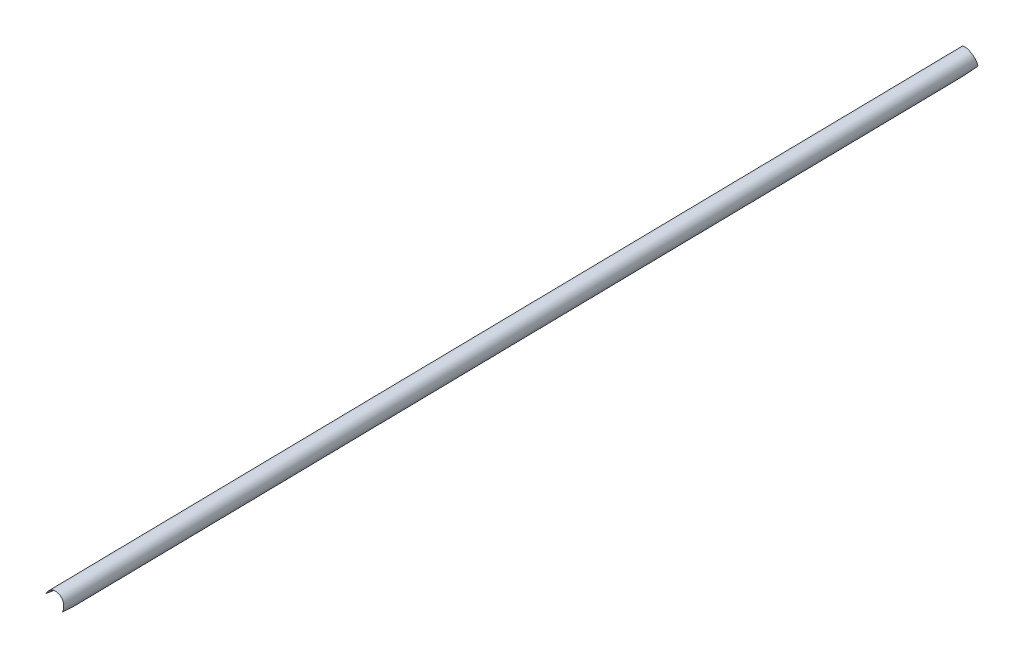
ISO-10303-21;
HEADER;
FILE_DESCRIPTION(('STEP AP214'),'2;1');
FILE_NAME('part.step','',(''),(''),'','','');
FILE_SCHEMA(('AUTOMOTIVE_DESIGN { 1 0 10303 214 1 1 1 1 }'));
ENDSEC;
DATA;
#1=APPLICATION_CONTEXT('core data for automotive mechanical design processes');
#2=APPLICATION_PROTOCOL_DEFINITION('international standard','automotive_design',2000,#1);
#3=PRODUCT_CONTEXT('',#1,'mechanical');
#4=PRODUCT('Part','Part','',(#3));
#5=PRODUCT_RELATED_PRODUCT_CATEGORY('part','',(#4));
#6=PRODUCT_DEFINITION_FORMATION('','',#4);
#7=PRODUCT_DEFINITION_CONTEXT('part definition',#1,'design');
#8=PRODUCT_DEFINITION('design','',#6,#7);
#9=PRODUCT_DEFINITION_SHAPE('','',#8);
#10=(LENGTH_UNIT() NAMED_UNIT(*) SI_UNIT(.MILLI.,.METRE.));
#11=(NAMED_UNIT(*) PLANE_ANGLE_UNIT() SI_UNIT($,.RADIAN.));
#12=(NAMED_UNIT(*) SI_UNIT($,.STERADIAN.) SOLID_ANGLE_UNIT());
#13=UNCERTAINTY_MEASURE_WITH_UNIT(LENGTH_MEASURE(1.E-05),#10,'distance_accuracy_value','');
#14=(GEOMETRIC_REPRESENTATION_CONTEXT(3) GLOBAL_UNCERTAINTY_ASSIGNED_CONTEXT((#13)) GLOBAL_UNIT_ASSIGNED_CONTEXT((#10,
#11,#12)) REPRESENTATION_CONTEXT('',''));
#15=CARTESIAN_POINT('',(0.,0.,0.));
#16=DIRECTION('',(0.,0.,1.));
#17=DIRECTION('',(1.,0.,0.));
#18=AXIS2_PLACEMENT_3D('',#15,#16,#17);
#19=CARTESIAN_POINT('',(324.999999999993,320.000000000003,-1580.));
#20=DIRECTION('',(-0.0876619818920163,-0.10519437827044,0.99058039537993));
#21=DIRECTION('',(0.,-0.994408591727349,-0.10560091239583));
#22=AXIS2_PLACEMENT_3D('',#19,#20,#21);
#23=CYLINDRICAL_SURFACE('',#22,11.3);
#24=CARTESIAN_POINT('',(228.906346641355,193.450798883095,-495.335007357299));
#25=CARTESIAN_POINT('',(229.084722743735,193.419449109905,-495.039847908933));
#26=CARTESIAN_POINT('',(229.253623092946,193.392941622863,-494.738442760999));
#27=CARTESIAN_POINT('',(229.576166320163,193.347594604839,-494.126951019015));
#28=CARTESIAN_POINT('',(229.729801067032,193.32875914394,-493.816859909961));
#29=CARTESIAN_POINT('',(230.024651309465,193.297354565438,-493.189903600017));
#30=CARTESIAN_POINT('',(230.165845067822,193.28479624332,-492.873027699643));
#31=CARTESIAN_POINT('',(230.437539311314,193.264977200147,-492.234553042767));
#32=CARTESIAN_POINT('',(230.568038599133,193.257717071541,-491.912953762192));
#33=CARTESIAN_POINT('',(230.820667381965,193.247712385438,-491.264065766833));
#34=CARTESIAN_POINT('',(230.942738101031,193.244996962547,-490.936753833744));
#35=CARTESIAN_POINT('',(231.178812347464,193.243590884282,-490.279224589377));
#36=CARTESIAN_POINT('',(231.2928155737,193.244900379064,-489.949007170163));
#37=CARTESIAN_POINT('',(231.513601759024,193.251092771302,-489.28660662457));
#38=CARTESIAN_POINT('',(231.620392422021,193.25597178796,-488.95442602131));
#39=CARTESIAN_POINT('',(231.827666710202,193.268953270525,-488.288163302831));
#40=CARTESIAN_POINT('',(231.928150134984,193.277055838797,-487.95408112756));
#41=CARTESIAN_POINT('',(232.228901864607,193.306530946405,-486.92286266796));
#42=CARTESIAN_POINT('',(232.41979352706,193.332786366844,-486.223119294367));
#43=CARTESIAN_POINT('',(232.781604853685,193.396249415354,-484.818961513991));
#44=CARTESIAN_POINT('',(232.952521976425,193.433458434976,-484.114546524845));
#45=CARTESIAN_POINT('',(233.277626543175,193.517838489495,-482.701881545574));
#46=CARTESIAN_POINT('',(233.431800457518,193.565017491468,-481.993628932459));
#47=CARTESIAN_POINT('',(233.725637259058,193.668776939329,-480.574860609513));
#48=CARTESIAN_POINT('',(233.865300847423,193.7253569306,-479.864345010746));
#49=CARTESIAN_POINT('',(234.131561727352,193.847601536044,-478.444057155071));
#50=CARTESIAN_POINT('',(234.258199866144,193.913236138749,-477.734289941639));
#51=CARTESIAN_POINT('',(234.50043965915,194.054010962758,-476.313804791448));
#52=CARTESIAN_POINT('',(234.616041075879,194.129151388526,-475.603086834565));
#53=CARTESIAN_POINT('',(234.837446286698,194.289637946118,-474.181617065538));
#54=CARTESIAN_POINT('',(234.943254556644,194.374979374404,-473.470865418889));
#55=CARTESIAN_POINT('',(235.146286756352,194.557210883326,-472.049638085316));
#56=CARTESIAN_POINT('',(235.243511012088,194.654100525097,-471.339162388935));
#57=CARTESIAN_POINT('',(235.418196715561,194.84798279673,-470.012454615724));
#58=CARTESIAN_POINT('',(235.496576808614,194.943291134696,-469.396098258282));
#59=CARTESIAN_POINT('',(235.648406357622,195.146497440309,-468.164772123489));
#60=CARTESIAN_POINT('',(235.721855265329,195.254396804181,-467.549802507635));
#61=CARTESIAN_POINT('',(235.864560562893,195.486122145514,-466.322140017813));
#62=CARTESIAN_POINT('',(235.933815741641,195.60995269179,-465.709447849044));
#63=CARTESIAN_POINT('',(236.035060470202,195.811557500717,-464.793658677394));
#64=CARTESIAN_POINT('',(236.068366740904,195.881396679684,-464.48895891525));
#65=CARTESIAN_POINT('',(236.134179843666,196.027317308605,-463.88097627572));
#66=CARTESIAN_POINT('',(236.166686706776,196.103398515607,-463.577693343673));
#67=CARTESIAN_POINT('',(236.236922701811,196.277747516162,-462.916923346777));
#68=CARTESIAN_POINT('',(236.274502640094,196.37751351725,-462.559811958254));
#69=CARTESIAN_POINT('',(236.348652293011,196.589950465177,-461.849368476551));
#70=CARTESIAN_POINT('',(236.385222183117,196.702619152773,-461.496035733545));
#71=CARTESIAN_POINT('',(236.45722802378,196.944283796766,-460.794770637445));
#72=CARTESIAN_POINT('',(236.492663825799,197.073281881052,-460.446838994815));
#73=CARTESIAN_POINT('',(236.561929750981,197.352055284574,-459.759218405918));
#74=CARTESIAN_POINT('',(236.595760515704,197.501822206645,-459.419526193214));
#75=CARTESIAN_POINT('',(236.649399821404,197.771316626385,-458.868371400781));
#76=CARTESIAN_POINT('',(236.670003058247,197.88345416383,-458.65328656504));
#77=CARTESIAN_POINT('',(236.709426960596,198.120868295843,-458.230244866014));
#78=CARTESIAN_POINT('',(236.728247573081,198.246145280979,-458.022288214856));
#79=CARTESIAN_POINT('',(236.763160524445,198.51124680967,-457.616322318315));
#80=CARTESIAN_POINT('',(236.779259834492,198.651032654479,-457.418288599001));
#81=CARTESIAN_POINT('',(236.807501886327,198.946814139092,-457.034387822026));
#82=CARTESIAN_POINT('',(236.819645858122,199.102804719709,-456.848516996418));
#83=CARTESIAN_POINT('',(236.836567794861,199.401235519372,-456.524827534103));
#84=CARTESIAN_POINT('',(236.842291355073,199.540866571628,-456.384470008079));
#85=CARTESIAN_POINT('',(236.848912008884,199.830983078117,-456.115355742765));
#86=CARTESIAN_POINT('',(236.849810199826,199.981466056609,-455.986596372472));
#87=CARTESIAN_POINT('',(236.84567143579,200.29236713364,-455.741850295963));
#88=CARTESIAN_POINT('',(236.840635690009,200.452783201737,-455.625860992774));
#89=CARTESIAN_POINT('',(236.823584155192,200.782122008638,-455.407232831261));
#90=CARTESIAN_POINT('',(236.811568016766,200.95104517286,-455.304594641515));
#91=CARTESIAN_POINT('',(236.779725744476,201.294989674343,-455.112975041747));
#92=CARTESIAN_POINT('',(236.759926049959,201.469988557728,-455.02394880164));
#93=CARTESIAN_POINT('',(236.711854184271,201.824710603628,-454.858548310711));
#94=CARTESIAN_POINT('',(236.683581961612,202.004433794848,-454.782174136781));
#95=CARTESIAN_POINT('',(236.61806458397,202.367069597396,-454.640976363745));
#96=CARTESIAN_POINT('',(236.580805389124,202.549986779628,-454.576171116556));
#97=CARTESIAN_POINT('',(236.497071019076,202.917135641824,-454.457043788662));
#98=CARTESIAN_POINT('',(236.450593611755,203.101367629722,-454.40272425329));
#99=CARTESIAN_POINT('',(236.326984143946,203.54645531018,-454.28260660446));
#100=CARTESIAN_POINT('',(236.245146542821,203.807269623702,-454.221448843698));
#101=CARTESIAN_POINT('',(236.062726728038,204.325444980738,-454.11425303536));
#102=CARTESIAN_POINT('',(235.962137928993,204.582804776887,-454.068220315412));
#103=CARTESIAN_POINT('',(235.742446451051,205.091667303815,-453.988328169526));
#104=CARTESIAN_POINT('',(235.623328875651,205.343165133053,-453.95447861164));
#105=CARTESIAN_POINT('',(235.367145928939,205.837961882194,-453.896592110663));
#106=CARTESIAN_POINT('',(235.230082218472,206.081261558188,-453.872554260383));
#107=CARTESIAN_POINT('',(234.936138029315,206.561989779518,-453.831996434652));
#108=CARTESIAN_POINT('',(234.778959182767,206.799247179034,-453.815611812274));
#109=CARTESIAN_POINT('',(234.447462936964,207.261844284722,-453.78934629819));
#110=CARTESIAN_POINT('',(234.273145316162,207.487183836779,-453.779465490569));
#111=CARTESIAN_POINT('',(233.908314454204,207.924428184603,-453.764922947872));
#112=CARTESIAN_POINT('',(233.717805299289,208.136336346609,-453.760259900178));
#113=CARTESIAN_POINT('',(233.321555308751,208.545457150593,-453.755136178475));
#114=CARTESIAN_POINT('',(233.11581387221,208.74266921219,-453.754675670346));
#115=CARTESIAN_POINT('',(232.667547907075,209.141330783778,-453.757296200155));
#116=CARTESIAN_POINT('',(232.423438584114,209.340999952622,-453.760759134578));
#117=CARTESIAN_POINT('',(231.919543244711,209.719393881331,-453.771041918049));
#118=CARTESIAN_POINT('',(231.65975614504,209.898117191462,-453.777861999288));
#119=CARTESIAN_POINT('',(231.126198221788,210.233355499364,-453.794275931706));
#120=CARTESIAN_POINT('',(230.852423212811,210.38986379651,-453.803870617139));
#121=CARTESIAN_POINT('',(230.292855768241,210.679472454453,-453.825444250645));
#122=CARTESIAN_POINT('',(230.007063487597,210.81257311695,-453.837423167984));
#123=CARTESIAN_POINT('',(229.423235876984,211.055343023285,-453.863658597851));
#124=CARTESIAN_POINT('',(229.125123950852,211.164826318805,-453.877931743152));
#125=CARTESIAN_POINT('',(228.520845613355,211.358297399202,-453.908659706934));
#126=CARTESIAN_POINT('',(228.214679116668,211.442284913884,-453.925114548534));
#127=CARTESIAN_POINT('',(227.596547427249,211.584184777348,-453.96035993362));
#128=CARTESIAN_POINT('',(227.284583196523,211.642101412491,-453.979150092505));
#129=CARTESIAN_POINT('',(226.657065544924,211.731522387414,-454.019427116227));
#130=CARTESIAN_POINT('',(226.341512136798,211.763026820972,-454.04091397149));
#131=CARTESIAN_POINT('',(225.709250576285,211.799471781888,-454.087163488993));
#132=CARTESIAN_POINT('',(225.392542978326,211.804423717397,-454.111924739719));
#133=CARTESIAN_POINT('',(224.760165994286,211.787867294798,-454.165591751936));
#134=CARTESIAN_POINT('',(224.444496622735,211.76635856792,-454.194497571183));
#135=CARTESIAN_POINT('',(223.816250704612,211.697144331621,-454.257682583141));
#136=CARTESIAN_POINT('',(223.503677656032,211.649412019693,-454.291967247786));
#137=CARTESIAN_POINT('',(222.884401080991,211.528283710804,-454.367512405962));
#138=CARTESIAN_POINT('',(222.57769737625,211.454888494654,-454.408772687234));
#139=CARTESIAN_POINT('',(221.973552589742,211.283526589802,-454.500304511905));
#140=CARTESIAN_POINT('',(221.676087709229,211.185630165252,-454.550550171529));
#141=CARTESIAN_POINT('',(221.092155474227,210.96636968699,-454.662965473626));
#142=CARTESIAN_POINT('',(220.805690213979,210.845001190675,-454.725137373384));
#143=CARTESIAN_POINT('',(220.247419334293,210.58090601133,-454.864873542486));
#144=CARTESIAN_POINT('',(219.975584198492,210.438224706673,-454.942405220157));
#145=CARTESIAN_POINT('',(219.44946385422,210.134036520854,-455.11736855306));
#146=CARTESIAN_POINT('',(219.195167214736,209.972542089641,-455.214787079544));
#147=CARTESIAN_POINT('',(218.794261846491,209.694601325627,-455.395577573599));
#148=CARTESIAN_POINT('',(218.641388957452,209.582436149759,-455.471721574933));
#149=CARTESIAN_POINT('',(218.345740258341,209.35345218358,-455.635666421718));
#150=CARTESIAN_POINT('',(218.202961111313,209.236634951377,-455.723463386856));
#151=CARTESIAN_POINT('',(217.928871529964,209.00035150112,-455.911577599975));
#152=CARTESIAN_POINT('',(217.797538046007,208.880891244328,-456.011868648094));
#153=CARTESIAN_POINT('',(217.54696649929,208.641112066716,-456.22569982633));
#154=CARTESIAN_POINT('',(217.427728398181,208.520793148618,-456.339239914439));
#155=CARTESIAN_POINT('',(217.201627274746,208.281020551442,-456.57989400785));
#156=CARTESIAN_POINT('',(217.094803999235,208.161570740169,-456.707049234854));
#157=CARTESIAN_POINT('',(216.894116159748,207.925858011345,-456.973892675194));
#158=CARTESIAN_POINT('',(216.800251457928,207.809595059905,-457.11358075519));
#159=CARTESIAN_POINT('',(216.625015253408,207.581676358599,-457.404298884527));
#160=CARTESIAN_POINT('',(216.543654202896,207.470024519698,-457.55533826743));
#161=CARTESIAN_POINT('',(216.392643290475,207.252358741357,-457.867059100495));
#162=CARTESIAN_POINT('',(216.32299783672,207.146346934269,-458.027744149254));
#163=CARTESIAN_POINT('',(216.160505691025,206.886373233337,-458.443487390125));
#164=CARTESIAN_POINT('',(216.074667058124,206.736447759892,-458.703813563675));
#165=CARTESIAN_POINT('',(215.923117723211,206.450470461129,-459.237587950817));
#166=CARTESIAN_POINT('',(215.857421355989,206.314428562156,-459.51104535026));
#167=CARTESIAN_POINT('',(215.741814079727,206.054115755362,-460.068252653972));
#168=CARTESIAN_POINT('',(215.691977358447,205.929902019364,-460.352044204916));
#169=CARTESIAN_POINT('',(215.626874816888,205.751564087348,-460.782342171288));
#170=CARTESIAN_POINT('',(215.606784669547,205.693455443719,-460.926524621738));
#171=CARTESIAN_POINT('',(215.569480730707,205.579651740959,-461.21620905421));
#172=CARTESIAN_POINT('',(215.552266907186,205.523956654966,-461.361711021524));
#173=CARTESIAN_POINT('',(215.505843705228,205.364846783189,-461.787313785757));
#174=CARTESIAN_POINT('',(215.480051789101,205.264346533512,-462.068879132873));
#175=CARTESIAN_POINT('',(215.436152887707,205.06996875526,-462.634900249183));
#176=CARTESIAN_POINT('',(215.418047343789,204.97609247156,-462.919356550256));
#177=CARTESIAN_POINT('',(215.388234534667,204.793754196807,-463.490518625651));
#178=CARTESIAN_POINT('',(215.376531324007,204.705295668185,-463.77722570908));
#179=CARTESIAN_POINT('',(215.358575270939,204.532897246613,-464.352172358848));
#180=CARTESIAN_POINT('',(215.352322796398,204.448957659001,-464.640412027299));
#181=CARTESIAN_POINT('',(215.340570244135,204.202287963403,-465.508234489082));
#182=CARTESIAN_POINT('',(215.342140755068,204.045149564713,-466.089503544346));
#183=CARTESIAN_POINT('',(215.360054986473,203.741048124285,-467.254175548324));
#184=CARTESIAN_POINT('',(215.376393589896,203.594081577054,-467.837577688209));
#185=CARTESIAN_POINT('',(215.421592247368,203.306480622755,-469.007864450682));
#186=CARTESIAN_POINT('',(215.450501019381,203.165873226553,-469.594753769894));
#187=CARTESIAN_POINT('',(215.519419313844,202.889275053593,-470.769002878985));
#188=CARTESIAN_POINT('',(215.559429709063,202.753284640748,-471.356362702231));
#189=CARTESIAN_POINT('',(215.649667944616,202.484439474702,-472.530070357294));
#190=CARTESIAN_POINT('',(215.699880251525,202.351580293075,-473.116418376957));
#191=CARTESIAN_POINT('',(215.810156934894,202.087502337687,-474.28853815738));
#192=CARTESIAN_POINT('',(215.870221042944,201.95628351934,-474.874309933403));
#193=CARTESIAN_POINT('',(215.996444392043,201.70184813012,-476.01188685851));
#194=CARTESIAN_POINT('',(216.062068594454,201.57859774612,-476.563743880726));
#195=CARTESIAN_POINT('',(216.20213192972,201.331929031285,-477.666306024639));
#196=CARTESIAN_POINT('',(216.276571118202,201.208510699396,-478.217011139043));
#197=CARTESIAN_POINT('',(216.43461126643,200.960809262154,-479.31722972636));
#198=CARTESIAN_POINT('',(216.518217124561,200.836525728009,-479.866742400558));
#199=CARTESIAN_POINT('',(216.695046338937,200.586575813579,-480.963902994573));
#200=CARTESIAN_POINT('',(216.788269628716,200.460909442856,-481.51155092725));
#201=CARTESIAN_POINT('',(216.98471847529,200.208017806577,-482.602838600997));
#202=CARTESIAN_POINT('',(217.087911904794,200.080798630881,-483.146485517312));
#203=CARTESIAN_POINT('',(217.305465179436,199.823838183406,-484.230939466429));
#204=CARTESIAN_POINT('',(217.419824805803,199.694096961079,-484.771746554651));
#205=CARTESIAN_POINT('',(217.660884710811,199.431513953388,-485.849595695003));
#206=CARTESIAN_POINT('',(217.787579544923,199.298673555451,-486.386639297066));
#207=CARTESIAN_POINT('',(218.054968459116,199.029121338322,-487.45623013825));
#208=CARTESIAN_POINT('',(218.195661495162,198.892409808396,-487.988777709492));
#209=CARTESIAN_POINT('',(218.493648262209,198.613858751595,-489.049520926403));
#210=CARTESIAN_POINT('',(218.650985582042,198.472006433243,-489.577701034124));
#211=CARTESIAN_POINT('',(218.985046052283,198.182353814681,-490.626549655019));
#212=CARTESIAN_POINT('',(219.161775701882,198.034551530957,-491.147215583314));
#213=CARTESIAN_POINT('',(219.444841769921,197.80717882364,-491.920531692447));
#214=CARTESIAN_POINT('',(219.542290613915,197.730369555458,-492.177256550306));
#215=CARTESIAN_POINT('',(219.743907178527,197.574654702993,-492.687402869537));
#216=CARTESIAN_POINT('',(219.848074420308,197.495749268345,-492.940824564791));
#217=CARTESIAN_POINT('',(220.063976367618,197.335603665136,-493.443493113035));
#218=CARTESIAN_POINT('',(220.175706463031,197.254364935973,-493.692742395865));
#219=CARTESIAN_POINT('',(220.407924141613,197.089174832986,-494.186188530378));
#220=CARTESIAN_POINT('',(220.528410446188,197.0052238562,-494.430386113056));
#221=CARTESIAN_POINT('',(220.780522960273,196.833564511718,-494.914111332393));
#222=CARTESIAN_POINT('',(220.912223275508,196.745833403706,-495.153592560447));
#223=CARTESIAN_POINT('',(221.18801108674,196.566621221534,-495.624117918182));
#224=CARTESIAN_POINT('',(221.332104730933,196.475138298049,-495.855157778269));
#225=CARTESIAN_POINT('',(221.634366025902,196.288333560091,-496.304395867813));
#226=CARTESIAN_POINT('',(221.7924573422,196.193033951979,-496.522654125173));
#227=CARTESIAN_POINT('',(222.126406780729,195.997583726374,-496.94261602));
#228=CARTESIAN_POINT('',(222.302241251363,195.897439656925,-497.144341062447));
#229=CARTESIAN_POINT('',(222.631960054622,195.715802204155,-497.479126461745));
#230=CARTESIAN_POINT('',(222.7813265035,195.635440315239,-497.617197487053));
#231=CARTESIAN_POINT('',(223.094949052165,195.471383782249,-497.873834029889));
#232=CARTESIAN_POINT('',(223.259221237838,195.387685593658,-497.992378076637));
#233=CARTESIAN_POINT('',(223.605988958748,195.216498057468,-498.203358462488));
#234=CARTESIAN_POINT('',(223.788699413988,195.12897291213,-498.295423198143));
#235=CARTESIAN_POINT('',(224.168745700422,194.953401437344,-498.44040327619));
#236=CARTESIAN_POINT('',(224.36603163524,194.865357756203,-498.493445939393));
#237=CARTESIAN_POINT('',(224.718913199978,194.714027456113,-498.544091614214));
#238=CARTESIAN_POINT('',(224.87269705381,194.650021883768,-498.552190177143));
#239=CARTESIAN_POINT('',(225.180660896105,194.525829921697,-498.539747343144));
#240=CARTESIAN_POINT('',(225.334840825478,194.4656429932,-498.519209995884));
#241=CARTESIAN_POINT('',(225.638490434946,194.350922778788,-498.451332569697));
#242=CARTESIAN_POINT('',(225.787976286129,194.296368142748,-498.404098459675));
#243=CARTESIAN_POINT('',(226.079901703072,194.193309277863,-498.286880823334));
#244=CARTESIAN_POINT('',(226.222334592682,194.144810717886,-498.216876200048));
#245=CARTESIAN_POINT('',(226.585306574446,194.025314334604,-498.009144030848));
#246=CARTESIAN_POINT('',(226.798855789709,193.959263450018,-497.856468669636));
#247=CARTESIAN_POINT('',(227.203756278744,193.84067039438,-497.519675163652));
#248=CARTESIAN_POINT('',(227.39503453697,193.788172006601,-497.335458229933));
#249=CARTESIAN_POINT('',(227.703514347913,193.708208134845,-497.005109457079));
#250=CARTESIAN_POINT('',(227.825697487547,193.677961836172,-496.864178517993));
#251=CARTESIAN_POINT('',(228.061751772613,193.621983870084,-496.574618048219));
#252=CARTESIAN_POINT('',(228.175620169086,193.596253691844,-496.425985998962));
#253=CARTESIAN_POINT('',(228.395986290244,193.548666106985,-496.122906753843));
#254=CARTESIAN_POINT('',(228.502487290937,193.526806972224,-495.968462190378));
#255=CARTESIAN_POINT('',(228.709045719155,193.486418866875,-495.654965735628));
#256=CARTESIAN_POINT('',(228.809104242114,193.467889329181,-495.495914634309));
#257=CARTESIAN_POINT('',(228.906346641355,193.450798883095,-495.335007357299));
#258=B_SPLINE_CURVE_WITH_KNOTS('',3,(#24,#25,#26,#27,#28,#29,#30,#31,#32,#33,#34,#35,#36,#37,
#38,#39,#40,#41,#42,#43,#44,#45,#46,#47,#48,#49,#50,#51,#52,#53,#54,#55,#56,#57,#58,#59,#60,#61,
#62,#63,#64,#65,#66,#67,#68,#69,#70,#71,#72,#73,#74,#75,#76,#77,#78,#79,#80,#81,#82,#83,#84,#85,
#86,#87,#88,#89,#90,#91,#92,#93,#94,#95,#96,#97,#98,#99,#100,#101,#102,#103,#104,#105,#106,#107,
#108,#109,#110,#111,#112,#113,#114,#115,#116,#117,#118,#119,#120,#121,#122,#123,#124,#125,#126,
#127,#128,#129,#130,#131,#132,#133,#134,#135,#136,#137,#138,#139,#140,#141,#142,#143,#144,#145,
#146,#147,#148,#149,#150,#151,#152,#153,#154,#155,#156,#157,#158,#159,#160,#161,#162,#163,#164,
#165,#166,#167,#168,#169,#170,#171,#172,#173,#174,#175,#176,#177,#178,#179,#180,#181,#182,#183,
#184,#185,#186,#187,#188,#189,#190,#191,#192,#193,#194,#195,#196,#197,#198,#199,#200,#201,#202,
#203,#204,#205,#206,#207,#208,#209,#210,#211,#212,#213,#214,#215,#216,#217,#218,#219,#220,#221,
#222,#223,#224,#225,#226,#227,#228,#229,#230,#231,#232,#233,#234,#235,#236,#237,#238,#239,#240,
#241,#242,#243,#244,#245,#246,#247,#248,#249,#250,#251,#252,#253,#254,#255,#256,#257),
.UNSPECIFIED.,.T.,.F.,(4,2,2,2,2,2,2,2,2,2,2,2,2,2,2,2,2,2,2,2,2,2,2,2,2,2,2,2,2,2,2,2,2,2,2,2,
2,2,2,2,2,2,2,2,2,2,2,2,2,2,2,2,2,2,2,2,2,2,2,2,2,2,2,2,2,2,2,2,2,2,2,2,2,2,2,2,2,2,2,2,2,2,2,2,
2,2,2,2,2,2,2,2,2,2,2,2,2,2,2,2,2,2,2,2,2,2,2,2,2,2,2,2,2,2,2,2,4),(0.,1.03878775099796,
2.07812587334838,3.11924536206593,4.16048125204948,5.20836694724718,6.25629173571775,
7.30307890580588,8.34989931905466,10.5267538865143,12.7038851221786,14.8827627410806,
17.0615350233724,19.2332519250163,21.4050155466249,23.5757816337112,25.7464652518819,
27.6321022410408,29.5179485287192,31.4043368584109,32.3473954812406,33.2904174159219,
34.4082809560393,35.5259490582523,36.6437629544199,37.7611262116422,38.4910616120942,
39.2210187158238,39.949076575591,40.6769078117942,41.2704665867226,41.8638903739538,
42.4571932562921,43.050525837796,43.641860152084,44.2331980601021,44.8254658362212,
45.4178772008965,46.2569971693614,47.0964123924121,47.9365059983099,48.7765219116654,
49.6308787789406,50.4852466916021,51.3393996248721,52.1935862726649,53.1386261295795,
54.0837313573432,55.0291210503492,55.9744985573987,56.9270676794506,57.8796468961398,
58.8320694403165,59.7844886029089,60.7364985304643,61.6885217258902,62.6415197768602,
63.5944888347503,64.5447556863922,65.4952025731985,66.4436539150547,67.391481128778,
68.003909587898,68.6161346241611,69.2270967896053,69.8380570179572,70.4509223179573,
71.0637810982626,71.6771494317073,72.2907480397411,73.2263959465103,74.1627081951098,
75.103338020485,75.5735332543064,76.0437232534417,76.943692029002,77.8438294922937,
78.744536347316,79.6453039859696,81.4512940208993,83.2566585316362,85.0690833108018,
86.8816506166063,88.6914785169347,90.5012571172187,92.2089344507205,93.9166225610301,
95.6252276959514,97.3338210232649,99.037081481849,100.740308576281,102.442787277255,
104.145139096369,105.852064980576,107.559564685471,108.414894174894,109.270162769994,
110.124914630894,110.979541929407,111.840335670476,112.701558932695,113.558345144839,
114.414003982312,115.069067254622,115.72484605848,116.389422920879,117.051821673414,
117.549744099894,118.047596117737,118.543485724781,119.039836090385,119.847239863284,
120.657220317046,121.223683075264,121.790332273202,122.356727861777,122.923026888726),.UNSPECIFIED.);
#259=CARTESIAN_POINT('',(228.906346641355,193.450798883095,-495.335007357299));
#260=VERTEX_POINT('',#259);
#261=EDGE_CURVE('E100',#260,#260,#258,.T.);
#262=ORIENTED_EDGE('',*,*,#261,.T.);
#263=EDGE_LOOP('',(#262));
#264=FACE_BOUND('',#263,.T.);
#265=CARTESIAN_POINT('',(320.335524257847,303.165812022908,-1528.48471442382));
#266=CARTESIAN_POINT('',(320.19462876352,303.145574663048,-1528.29413625689));
#267=CARTESIAN_POINT('',(320.05026299213,303.127609648766,-1528.10587379894));
#268=CARTESIAN_POINT('',(319.753330273276,303.097215479988,-1527.73529496625));
#269=CARTESIAN_POINT('',(319.600760216705,303.084788440976,-1527.55298088836));
#270=CARTESIAN_POINT('',(319.286613483129,303.066885595453,-1527.19715331803));
#271=CARTESIAN_POINT('',(319.125075432991,303.06138207617,-1527.023607426));
#272=CARTESIAN_POINT('',(318.790733475052,303.059148441317,-1526.6877862436));
#273=CARTESIAN_POINT('',(318.617940451957,303.062409968453,-1526.52550036842));
#274=CARTESIAN_POINT('',(318.287251948506,303.079025892338,-1526.24146377589));
#275=CARTESIAN_POINT('',(318.131319671582,303.09070323989,-1526.11736073209));
#276=CARTESIAN_POINT('',(317.808407786493,303.124549316262,-1525.88513275273));
#277=CARTESIAN_POINT('',(317.641411607269,303.14673410286,-1525.7770326063));
#278=CARTESIAN_POINT('',(317.293576109702,303.204934470749,-1525.58265301722));
#279=CARTESIAN_POINT('',(317.112564665168,303.241155594936,-1525.4967310653));
#280=CARTESIAN_POINT('',(316.741855877901,303.330469700822,-1525.35965576634));
#281=CARTESIAN_POINT('',(316.552199485694,303.383489037412,-1525.30835365866));
#282=CARTESIAN_POINT('',(316.2298433367,303.488374420098,-1525.25913687127));
#283=CARTESIAN_POINT('',(316.097404892691,303.535665247786,-1525.24971505641));
#284=CARTESIAN_POINT('',(315.835847903748,303.63789426005,-1525.25382594856));
#285=CARTESIAN_POINT('',(315.706728781032,303.692831102888,-1525.26735463283));
#286=CARTESIAN_POINT('',(315.455967829271,303.808322737185,-1525.3162589535));
#287=CARTESIAN_POINT('',(315.334302681042,303.868858345807,-1525.35156218132));
#288=CARTESIAN_POINT('',(315.100156707594,303.993675927822,-1525.44088461082));
#289=CARTESIAN_POINT('',(314.987684342928,304.057961261077,-1525.49492081891));
#290=CARTESIAN_POINT('',(314.709203740742,304.227086990574,-1525.65429775971));
#291=CARTESIAN_POINT('',(314.550754852487,304.333479876046,-1525.77109911994));
#292=CARTESIAN_POINT('',(314.256606518046,304.547266355673,-1526.02971237358));
#293=CARTESIAN_POINT('',(314.120980108484,304.654662043637,-1526.1716016905));
#294=CARTESIAN_POINT('',(313.871187514735,304.866420171786,-1526.46871750973));
#295=CARTESIAN_POINT('',(313.756651981837,304.970800745655,-1526.62362712191));
#296=CARTESIAN_POINT('',(313.542279748921,305.17816941399,-1526.94429498685));
#297=CARTESIAN_POINT('',(313.442458523433,305.281155940496,-1527.11006439965));
#298=CARTESIAN_POINT('',(313.254649373992,305.485743346011,-1527.44961854879));
#299=CARTESIAN_POINT('',(313.166692471424,305.587339991367,-1527.6234227609));
#300=CARTESIAN_POINT('',(313.000837693393,305.788855418041,-1527.97652777822));
#301=CARTESIAN_POINT('',(312.922934903078,305.888774998234,-1528.15582584436));
#302=CARTESIAN_POINT('',(312.783866967914,306.075856484253,-1528.49809675069));
#303=CARTESIAN_POINT('',(312.721805401064,306.163182007469,-1528.66061964964));
#304=CARTESIAN_POINT('',(312.603401621683,306.336717803103,-1528.98832985462));
#305=CARTESIAN_POINT('',(312.547059931179,306.422927973101,-1529.15351740224));
#306=CARTESIAN_POINT('',(312.385463014452,306.680089521138,-1529.65245165697));
#307=CARTESIAN_POINT('',(312.287692692236,306.849493904045,-1529.98942595727));
#308=CARTESIAN_POINT('',(312.107700057663,307.185074898968,-1530.66987040791));
#309=CARTESIAN_POINT('',(312.025509379193,307.351244341848,-1531.01335224942));
#310=CARTESIAN_POINT('',(311.873995387242,307.680548668409,-1531.70460757149));
#311=CARTESIAN_POINT('',(311.804673595248,307.843683191224,-1532.05238155433));
#312=CARTESIAN_POINT('',(311.676540925319,308.167954530721,-1532.75248996968));
#313=CARTESIAN_POINT('',(311.6177730013,308.329080805745,-1533.10483704751));
#314=CARTESIAN_POINT('',(311.509494866645,308.649023898307,-1533.81200214907));
#315=CARTESIAN_POINT('',(311.459985128334,308.807840597637,-1534.16682029789));
#316=CARTESIAN_POINT('',(311.36906526341,309.123243148239,-1534.87793007317));
#317=CARTESIAN_POINT('',(311.327645034195,309.279831552661,-1535.23421928694));
#318=CARTESIAN_POINT('',(311.251879120298,309.591221129951,-1535.94832816682));
#319=CARTESIAN_POINT('',(311.217533577294,309.746022266969,-1536.30614786343));
#320=CARTESIAN_POINT('',(311.138512425453,310.136184517951,-1537.21418711815));
#321=CARTESIAN_POINT('',(311.098097208233,310.370477468526,-1537.76523751223));
#322=CARTESIAN_POINT('',(311.029979174186,310.835962000341,-1538.86943373274));
#323=CARTESIAN_POINT('',(311.002276887235,311.06715345192,-1539.42257964554));
#324=CARTESIAN_POINT('',(310.958020926997,311.527045412489,-1540.53064519916));
#325=CARTESIAN_POINT('',(310.941472450461,311.755744711589,-1541.08556554592));
#326=CARTESIAN_POINT('',(310.918352849339,312.210992855057,-1542.19650319077));
#327=CARTESIAN_POINT('',(310.911781965558,312.437541647394,-1542.75252051503));
#328=CARTESIAN_POINT('',(310.907707928639,312.888174103286,-1543.86353980121));
#329=CARTESIAN_POINT('',(310.910176239194,313.112263288451,-1544.41853943392));
#330=CARTESIAN_POINT('',(310.923414752586,313.559079778655,-1545.52899459201));
#331=CARTESIAN_POINT('',(310.934185090298,313.781807061509,-1546.08445012465));
#332=CARTESIAN_POINT('',(310.963485051138,314.226220384329,-1547.19543456453));
#333=CARTESIAN_POINT('',(310.982013029854,314.447906634902,-1547.7509634313));
#334=CARTESIAN_POINT('',(311.026430655966,314.890670254533,-1548.86197120383));
#335=CARTESIAN_POINT('',(311.052320363678,315.111747618588,-1549.41745010916));
#336=CARTESIAN_POINT('',(311.13220609073,315.711679073743,-1550.92513850859));
#337=CARTESIAN_POINT('',(311.193063399063,316.090336430295,-1551.87706876397));
#338=CARTESIAN_POINT('',(311.33492782748,316.849473267785,-1553.77879389271));
#339=CARTESIAN_POINT('',(311.415936574526,317.229952893413,-1554.72858858739));
#340=CARTESIAN_POINT('',(311.553008900856,317.804563090684,-1556.15045411135));
#341=CARTESIAN_POINT('',(311.601306090345,317.996794030119,-1556.6240494426));
#342=CARTESIAN_POINT('',(311.703309371397,318.383079461932,-1557.56990973956));
#343=CARTESIAN_POINT('',(311.757015403451,318.577133934226,-1558.04217471984));
#344=CARTESIAN_POINT('',(311.87015951677,318.967707349963,-1558.98494079684));
#345=CARTESIAN_POINT('',(311.929596998775,319.164226033891,-1559.45544207263));
#346=CARTESIAN_POINT('',(312.054713771712,319.560582702496,-1560.39420494596));
#347=CARTESIAN_POINT('',(312.120392944098,319.760420624072,-1560.86246658586));
#348=CARTESIAN_POINT('',(312.266412448434,320.186932987667,-1561.84793243783));
#349=CARTESIAN_POINT('',(312.347570943268,320.414122358105,-1562.36479441964));
#350=CARTESIAN_POINT('',(312.520024072148,320.875888682723,-1563.39359850173));
#351=CARTESIAN_POINT('',(312.611319925642,321.110466523244,-1563.90554000205));
#352=CARTESIAN_POINT('',(312.806418162185,321.589799443093,-1564.92273379517));
#353=CARTESIAN_POINT('',(312.910228679827,321.834561073517,-1565.42798149762));
#354=CARTESIAN_POINT('',(313.07805992649,322.211963324365,-1566.17792130966));
#355=CARTESIAN_POINT('',(313.136017309659,322.339462417383,-1566.42655784451));
#356=CARTESIAN_POINT('',(313.256651587285,322.598486992011,-1566.92055965609));
#357=CARTESIAN_POINT('',(313.319328236263,322.730012263983,-1567.16592510218));
#358=CARTESIAN_POINT('',(313.466452963492,323.030970565033,-1567.71296389328));
#359=CARTESIAN_POINT('',(313.552445295992,323.201714813799,-1568.01350926797));
#360=CARTESIAN_POINT('',(313.73514409334,323.551992080069,-1568.60607136537));
#361=CARTESIAN_POINT('',(313.831848003052,323.731522995924,-1568.89809010111));
#362=CARTESIAN_POINT('',(314.038690551786,324.100808517749,-1569.47020692886));
#363=CARTESIAN_POINT('',(314.148811877736,324.290549775905,-1569.75031976669));
#364=CARTESIAN_POINT('',(314.386254054911,324.681911917239,-1570.29452248231));
#365=CARTESIAN_POINT('',(314.513565282908,324.883526118368,-1570.55862120607));
#366=CARTESIAN_POINT('',(314.741494752575,325.226423321237,-1570.976066141));
#367=CARTESIAN_POINT('',(314.835837583135,325.364095594744,-1571.13579711017));
#368=CARTESIAN_POINT('',(315.035016598921,325.64444005386,-1571.44388235275));
#369=CARTESIAN_POINT('',(315.139848705022,325.787110281919,-1571.59224100934));
#370=CARTESIAN_POINT('',(315.361037501483,326.076424446302,-1571.87517437132));
#371=CARTESIAN_POINT('',(315.477369351878,326.223059341364,-1572.0097775623));
#372=CARTESIAN_POINT('',(315.722688295147,326.519159581747,-1572.26350452693));
#373=CARTESIAN_POINT('',(315.851674545716,326.668624738147,-1572.38262932961));
#374=CARTESIAN_POINT('',(316.124063133062,326.969728241314,-1572.6048955765));
#375=CARTESIAN_POINT('',(316.267590836863,327.12137374108,-1572.70787434358));
#376=CARTESIAN_POINT('',(316.567881709621,327.422775596594,-1572.89573073826));
#377=CARTESIAN_POINT('',(316.724645208363,327.572531905164,-1572.98060791466));
#378=CARTESIAN_POINT('',(317.050903203298,327.867555000937,-1573.13267994902));
#379=CARTESIAN_POINT('',(317.220415027884,328.012815284216,-1573.199850159));
#380=CARTESIAN_POINT('',(317.57086571584,328.296048042725,-1573.31762979527));
#381=CARTESIAN_POINT('',(317.75180494645,328.434020283479,-1573.368238689));
#382=CARTESIAN_POINT('',(318.104915187398,328.687008577473,-1573.45041061576));
#383=CARTESIAN_POINT('',(318.276113783328,328.802933564624,-1573.48338488684));
#384=CARTESIAN_POINT('',(318.625717047897,329.025975645536,-1573.53908867521));
#385=CARTESIAN_POINT('',(318.804120976395,329.133093640548,-1573.56181924185));
#386=CARTESIAN_POINT('',(319.167259174252,329.33764403007,-1573.59863527339));
#387=CARTESIAN_POINT('',(319.351993952223,329.435075643925,-1573.61272004196));
#388=CARTESIAN_POINT('',(319.7269606834,329.619605090419,-1573.63374680293));
#389=CARTESIAN_POINT('',(319.917193420894,329.706701439586,-1573.64068777102));
#390=CARTESIAN_POINT('',(320.343338578884,329.887458873744,-1573.64964863356));
#391=CARTESIAN_POINT('',(320.580361528809,329.978576649404,-1573.65030798393));
#392=CARTESIAN_POINT('',(321.060032089025,330.14433095327,-1573.64523000439));
#393=CARTESIAN_POINT('',(321.302680233467,330.218965909175,-1573.63949206456));
#394=CARTESIAN_POINT('',(321.792496982227,330.351414157413,-1573.62337556328));
#395=CARTESIAN_POINT('',(322.039667756716,330.409219136309,-1573.6129947148));
#396=CARTESIAN_POINT('',(322.537246767465,330.507730682427,-1573.58905050935));
#397=CARTESIAN_POINT('',(322.787655266466,330.54843585291,-1573.57548689256));
#398=CARTESIAN_POINT('',(323.335855238031,330.618395854904,-1573.54375919536));
#399=CARTESIAN_POINT('',(323.634060948996,330.644269885889,-1573.52520650235));
#400=CARTESIAN_POINT('',(324.231527829897,330.671965302493,-1573.48693098716));
#401=CARTESIAN_POINT('',(324.530789109425,330.673784112448,-1573.46720803991));
#402=CARTESIAN_POINT('',(325.128600976542,330.653450777666,-1573.42781557396));
#403=CARTESIAN_POINT('',(325.427151296798,330.631290716616,-1573.40814607505));
#404=CARTESIAN_POINT('',(326.021591417104,330.563208828205,-1573.36980688662));
#405=CARTESIAN_POINT('',(326.317481195963,330.517286811742,-1573.35113720505));
#406=CARTESIAN_POINT('',(326.920259082637,330.398988551984,-1573.31454624586));
#407=CARTESIAN_POINT('',(327.226904912858,330.325345583581,-1573.2967162761));
#408=CARTESIAN_POINT('',(327.833104988812,330.152668110847,-1573.26346363268));
#409=CARTESIAN_POINT('',(328.132658931695,330.053632524288,-1573.24804106167));
#410=CARTESIAN_POINT('',(328.722580003548,329.830883675171,-1573.21988407486));
#411=CARTESIAN_POINT('',(329.012947088246,329.707170293708,-1573.20714967203));
#412=CARTESIAN_POINT('',(329.582445127572,329.435930702733,-1573.18440439142));
#413=CARTESIAN_POINT('',(329.861576166292,329.288404671478,-1573.17439349326));
#414=CARTESIAN_POINT('',(330.408241848271,328.969599189143,-1573.15682901632));
#415=CARTESIAN_POINT('',(330.67569762064,328.798183642162,-1573.14929041135));
#416=CARTESIAN_POINT('',(331.195281888628,328.433437001193,-1573.13626493218));
#417=CARTESIAN_POINT('',(331.447410174547,328.240105607471,-1573.13077808604));
#418=CARTESIAN_POINT('',(331.934543682489,327.832760635158,-1573.12106638423));
#419=CARTESIAN_POINT('',(332.169542948408,327.618739922083,-1573.11684196597));
#420=CARTESIAN_POINT('',(332.620518865565,327.171515911567,-1573.10852154049));
#421=CARTESIAN_POINT('',(332.836495888922,326.938312989546,-1573.10442553077));
#422=CARTESIAN_POINT('',(333.247192905554,326.454919019918,-1573.0948225772));
#423=CARTESIAN_POINT('',(333.441965230912,326.204772385735,-1573.08931922455));
#424=CARTESIAN_POINT('',(333.809265903279,325.688687618166,-1573.07485281749));
#425=CARTESIAN_POINT('',(333.981792202694,325.422748034435,-1573.06588944491));
#426=CARTESIAN_POINT('',(334.302939133309,324.877243593588,-1573.04184578404));
#427=CARTESIAN_POINT('',(334.451572587219,324.59768615053,-1573.0267687922));
#428=CARTESIAN_POINT('',(334.723563461132,324.02720631668,-1572.98709387246));
#429=CARTESIAN_POINT('',(334.846928798893,323.73628752009,-1572.962498934));
#430=CARTESIAN_POINT('',(335.038641134415,323.222423337487,-1572.90767893814));
#431=CARTESIAN_POINT('',(335.112965127444,323.001362599251,-1572.88055629851));
#432=CARTESIAN_POINT('',(335.246641167456,322.556139883176,-1572.81671280149));
#433=CARTESIAN_POINT('',(335.305997009106,322.331978706579,-1572.77999438159));
#434=CARTESIAN_POINT('',(335.409435940645,321.882723755239,-1572.69485162455));
#435=CARTESIAN_POINT('',(335.45354372444,321.657632091466,-1572.64644643189));
#436=CARTESIAN_POINT('',(335.526669543254,321.208375561033,-1572.53574394009));
#437=CARTESIAN_POINT('',(335.555687622068,320.984210691684,-1572.47344668125));
#438=CARTESIAN_POINT('',(335.599283993253,320.537339116792,-1572.33246211175));
#439=CARTESIAN_POINT('',(335.613727259177,320.314664696958,-1572.25362956612));
#440=CARTESIAN_POINT('',(335.628693899518,319.87571937075,-1572.07872073457));
#441=CARTESIAN_POINT('',(335.62921867672,319.659447821252,-1571.98264618738));
#442=CARTESIAN_POINT('',(335.617886029583,319.236064317641,-1571.77311691843));
#443=CARTESIAN_POINT('',(335.606038882013,319.028944910121,-1571.65967668827));
#444=CARTESIAN_POINT('',(335.571896521486,318.625619232736,-1571.41620371568));
#445=CARTESIAN_POINT('',(335.549599742589,318.429414603449,-1571.28616848853));
#446=CARTESIAN_POINT('',(335.492158921961,318.017025804225,-1570.98806252743));
#447=CARTESIAN_POINT('',(335.455485523206,317.803025507506,-1570.81727228234));
#448=CARTESIAN_POINT('',(335.373727962582,317.391548975052,-1570.45871948388));
#449=CARTESIAN_POINT('',(335.328641119058,317.194078036944,-1570.27095152899));
#450=CARTESIAN_POINT('',(335.232324544375,316.813823379992,-1569.88105640923));
#451=CARTESIAN_POINT('',(335.181069660525,316.631105250471,-1569.67887192001));
#452=CARTESIAN_POINT('',(335.101083386706,316.36753454025,-1569.36765810576));
#453=CARTESIAN_POINT('',(335.073905561924,316.281433195312,-1569.26260335909));
#454=CARTESIAN_POINT('',(335.01867683792,316.112480080053,-1569.05013584058));
#455=CARTESIAN_POINT('',(334.990625949426,316.029628269827,-1568.94272309773));
#456=CARTESIAN_POINT('',(334.909988874343,315.798771590644,-1568.63493535806));
#457=CARTESIAN_POINT('',(334.856541541507,315.654353482825,-1568.4320912985));
#458=CARTESIAN_POINT('',(334.747878004622,315.374341259171,-1568.02083555782));
#459=CARTESIAN_POINT('',(334.692661387587,315.238749226243,-1567.81242257871));
#460=CARTESIAN_POINT('',(334.580876409325,314.975089255707,-1567.39101129785));
#461=CARTESIAN_POINT('',(334.52430697604,314.84702758367,-1567.17800937374));
#462=CARTESIAN_POINT('',(334.410158636408,314.59749339378,-1566.74843598463));
#463=CARTESIAN_POINT('',(334.352579633678,314.476021509627,-1566.53186417894));
#464=CARTESIAN_POINT('',(334.178254067471,314.119306363837,-1565.87637085904));
#465=CARTESIAN_POINT('',(334.060298809128,313.89263945373,-1565.4331015489));
#466=CARTESIAN_POINT('',(333.822097928424,313.45663991562,-1564.53908566557));
#467=CARTESIAN_POINT('',(333.701853290241,313.247300037033,-1564.08834231566));
#468=CARTESIAN_POINT('',(333.458116100385,312.840009339228,-1563.17713198425));
#469=CARTESIAN_POINT('',(333.334603459118,312.642187006374,-1562.71661320623));
#470=CARTESIAN_POINT('',(333.085475895185,312.257281165037,-1561.79164850646));
#471=CARTESIAN_POINT('',(332.959860791174,312.070198589135,-1561.32720224767));
#472=CARTESIAN_POINT('',(332.706726597947,311.705167213498,-1560.39652163628));
#473=CARTESIAN_POINT('',(332.579212334955,311.527199125302,-1559.93029351143));
#474=CARTESIAN_POINT('',(332.321867332755,311.178494542903,-1558.99579882271));
#475=CARTESIAN_POINT('',(332.192036652836,311.007757863986,-1558.52753231123));
#476=CARTESIAN_POINT('',(331.924929898206,310.666092898214,-1557.57178003697));
#477=CARTESIAN_POINT('',(331.787557863821,310.495401157439,-1557.08423665251));
#478=CARTESIAN_POINT('',(331.509918274814,310.159747715669,-1556.1080006601));
#479=CARTESIAN_POINT('',(331.369650680904,309.994786092503,-1555.61930803662));
#480=CARTESIAN_POINT('',(330.944159089187,309.507442605771,-1554.15201489612));
#481=CARTESIAN_POINT('',(330.654260275303,309.192619929903,-1553.17224942433));
#482=CARTESIAN_POINT('',(330.059673007198,308.579320228642,-1551.21048149429));
#483=CARTESIAN_POINT('',(329.754964493537,308.280866608277,-1550.2284778218));
#484=CARTESIAN_POINT('',(329.128896033671,307.699189206089,-1548.26532336045));
#485=CARTESIAN_POINT('',(328.807536991492,307.415964599116,-1547.28417252823));
#486=CARTESIAN_POINT('',(328.147537417842,306.8660661734,-1545.33059616036));
#487=CARTESIAN_POINT('',(327.80902249769,306.59929691824,-1544.35815530854));
#488=CARTESIAN_POINT('',(327.28415952761,306.210540628226,-1542.90254305212));
#489=CARTESIAN_POINT('',(327.106342206869,306.08284526227,-1542.41780937076));
#490=CARTESIAN_POINT('',(326.744434628902,305.831454437497,-1541.4496515386));
#491=CARTESIAN_POINT('',(326.560344473991,305.707758913504,-1540.96622736658));
#492=CARTESIAN_POINT('',(326.185470325166,305.464791885744,-1540.00165606022));
#493=CARTESIAN_POINT('',(325.994695734564,305.345514617286,-1539.52050672872));
#494=CARTESIAN_POINT('',(325.605400810528,305.111576902962,-1538.56023231319));
#495=CARTESIAN_POINT('',(325.406880695686,304.996916326991,-1538.08110717245));
#496=CARTESIAN_POINT('',(325.001118345238,304.772732127757,-1537.12548102556));
#497=CARTESIAN_POINT('',(324.793878089224,304.663207350408,-1536.6489794513));
#498=CARTESIAN_POINT('',(324.369361623143,304.449945650859,-1535.69917803014));
#499=CARTESIAN_POINT('',(324.152086086512,304.346208341309,-1535.22587797084));
#500=CARTESIAN_POINT('',(323.800783476581,304.188183259308,-1534.48397394637));
#501=CARTESIAN_POINT('',(323.670684427868,304.131641132899,-1534.21398715891));
#502=CARTESIAN_POINT('',(323.406209523603,304.021011530196,-1533.67560482601));
#503=CARTESIAN_POINT('',(323.271833665971,303.966924055094,-1533.40720928136));
#504=CARTESIAN_POINT('',(322.998249006477,303.861456392792,-1532.87213963246));
#505=CARTESIAN_POINT('',(322.859037314514,303.810077872415,-1532.60546667466));
#506=CARTESIAN_POINT('',(322.575282336744,303.710421734696,-1532.07438545473));
#507=CARTESIAN_POINT('',(322.430739128775,303.662144072111,-1531.80997715961));
#508=CARTESIAN_POINT('',(322.135615419182,303.569144071369,-1531.28392138757));
#509=CARTESIAN_POINT('',(321.985035128338,303.524421609248,-1531.02227381467));
#510=CARTESIAN_POINT('',(321.676956054315,303.439119378098,-1530.50240289343));
#511=CARTESIAN_POINT('',(321.519457670492,303.398539370391,-1530.24417934856));
#512=CARTESIAN_POINT('',(321.196554779188,303.322332259004,-1529.73228563544));
#513=CARTESIAN_POINT('',(321.031157464249,303.286700760702,-1529.47861160357));
#514=CARTESIAN_POINT('',(320.690912704369,303.221407423802,-1528.97692997245));
#515=CARTESIAN_POINT('',(320.516067548022,303.191744147643,-1528.72892102145));
#516=CARTESIAN_POINT('',(320.335524257847,303.165812022908,-1528.48471442382));
#517=B_SPLINE_CURVE_WITH_KNOTS('',3,(#265,#266,#267,#268,#269,#270,#271,#272,#273,#274,#275,
#276,#277,#278,#279,#280,#281,#282,#283,#284,#285,#286,#287,#288,#289,#290,#291,#292,#293,#294,
#295,#296,#297,#298,#299,#300,#301,#302,#303,#304,#305,#306,#307,#308,#309,#310,#311,#312,#313,
#314,#315,#316,#317,#318,#319,#320,#321,#322,#323,#324,#325,#326,#327,#328,#329,#330,#331,#332,
#333,#334,#335,#336,#337,#338,#339,#340,#341,#342,#343,#344,#345,#346,#347,#348,#349,#350,#351,
#352,#353,#354,#355,#356,#357,#358,#359,#360,#361,#362,#363,#364,#365,#366,#367,#368,#369,#370,
#371,#372,#373,#374,#375,#376,#377,#378,#379,#380,#381,#382,#383,#384,#385,#386,#387,#388,#389,
#390,#391,#392,#393,#394,#395,#396,#397,#398,#399,#400,#401,#402,#403,#404,#405,#406,#407,#408,
#409,#410,#411,#412,#413,#414,#415,#416,#417,#418,#419,#420,#421,#422,#423,#424,#425,#426,#427,
#428,#429,#430,#431,#432,#433,#434,#435,#436,#437,#438,#439,#440,#441,#442,#443,#444,#445,#446,
#447,#448,#449,#450,#451,#452,#453,#454,#455,#456,#457,#458,#459,#460,#461,#462,#463,#464,#465,
#466,#467,#468,#469,#470,#471,#472,#473,#474,#475,#476,#477,#478,#479,#480,#481,#482,#483,#484,
#485,#486,#487,#488,#489,#490,#491,#492,#493,#494,#495,#496,#497,#498,#499,#500,#501,#502,#503,
#504,#505,#506,#507,#508,#509,#510,#511,#512,#513,#514,#515,#516),.UNSPECIFIED.,.T.,.F.,(4,2,2,
2,2,2,2,2,2,2,2,2,2,2,2,2,2,2,2,2,2,2,2,2,2,2,2,2,2,2,2,2,2,2,2,2,2,2,2,2,2,2,2,2,2,2,2,2,2,2,2,
2,2,2,2,2,2,2,2,2,2,2,2,2,2,2,2,2,2,2,2,2,2,2,2,2,2,2,2,2,2,2,2,2,2,2,2,2,2,2,2,2,2,2,2,2,2,2,2,
2,2,2,2,2,2,2,2,2,2,2,2,2,2,2,2,2,2,2,2,2,2,2,2,2,2,4),(0.,0.713546838698993,1.42736601629866,
2.13831880369288,2.8485939527299,3.4465846474521,4.04549217248897,4.65352314050973,
5.25892448825631,5.67977845440545,6.10055866118393,6.51994710316206,6.93971728086422,
7.60711943727692,8.2766183926087,8.9329607101927,9.58998842985242,10.2487020759265,
10.9070924868662,11.4909425680412,12.0748458865794,13.2431717353025,14.4138449944252,
15.5846565739987,16.7601303534702,17.9356640858118,19.1097202288462,20.2837998813974,
22.0840714681303,23.8844180833424,25.6856029320501,27.4868312506653,29.2823780859811,
31.0779540925879,32.8731496776625,34.6683599719012,37.7469961889795,40.8258810456094,
42.366049353891,43.906200718739,45.4461912247765,46.9861524881916,48.6972006051008,
50.4084547715826,52.1208273205647,52.9768635447209,53.8328552716683,54.9011509160202,
55.9691922758458,57.035869807255,58.1019526494597,58.7945254109451,59.4868298801511,
60.1776703260969,60.8684648193891,61.5658250482499,62.2632026577678,62.9615459463294,
63.6599116888496,64.2874355935503,64.9148952013891,65.5424053372749,66.1700054341899,
66.9310811959721,67.6922295257331,68.4537532015378,69.2153390676645,70.1140364118921,
71.0128299815336,71.9119203667257,72.8110179071363,73.7575031339967,74.7040287065419,
75.6505588398414,76.5970818879531,77.5492361390706,78.5014034139443,79.4539002125231,
80.4063783739892,81.3564498716716,82.3066087545274,83.2562559953142,84.2056052076326,
84.9093643583818,85.6129449151493,86.3153806408137,87.0178143278076,87.7266974718459,
88.4355091702594,89.1437325604193,89.852062116099,90.6794335240926,91.5070690957127,
92.3382019762231,92.7537223922854,93.1692377039791,93.9329708437021,94.6968835718789,
95.4614231662116,96.2260361519661,97.760413889309,99.2941462778357,100.842588423876,
102.391164825122,103.936315787794,105.481427258366,107.084923703322,108.688441919291,
111.895643842389,115.107317986308,118.318817937349,121.509487413371,123.10507158281,
124.700629739445,126.294026986789,127.887379297964,129.480371827525,131.073257611264,
131.988175369365,132.903093572457,133.818568309306,134.734029685765,135.649459127587,
136.564835794644,137.479394272925,138.393732198123),.UNSPECIFIED.);
#518=CARTESIAN_POINT('',(320.335524257847,303.165812022908,-1528.48471442382));
#519=VERTEX_POINT('',#518);
#520=EDGE_CURVE('E92',#519,#519,#517,.T.);
#521=ORIENTED_EDGE('',*,*,#520,.T.);
#522=EDGE_LOOP('',(#521));
#523=FACE_BOUND('',#522,.T.);
#524=ADVANCED_FACE('F41',(#264,#523),#23,.F.);
#525=CARTESIAN_POINT('',(324.999999999993,320.000000000003,-1580.));
#526=DIRECTION('',(-0.0876619818920163,-0.10519437827044,0.99058039537993));
#527=DIRECTION('',(0.,-0.994408591727349,-0.10560091239583));
#528=AXIS2_PLACEMENT_3D('',#525,#526,#527);
#529=CYLINDRICAL_SURFACE('',#528,12.5);
#530=CARTESIAN_POINT('',(225.000000000008,199.999999999997,-449.999999999998));
#531=DIRECTION('',(-0.375454370679202,-0.919670602355291,0.115065193265994));
#532=DIRECTION('',(0.0039316627222095,0.122566257616358,0.992452545224284));
#533=AXIS2_PLACEMENT_3D('',#530,#531,#532);
#534=ELLIPSE('',#533,51.3055042410555,12.5);
#535=CARTESIAN_POINT('',(213.414593247558,204.663413041586,-450.530027531196));
#536=VERTEX_POINT('',#535);
#537=CARTESIAN_POINT('',(236.585406752457,195.336586958408,-449.4699724688));
#538=VERTEX_POINT('',#537);
#539=EDGE_CURVE('E124',#536,#538,#534,.T.);
#540=ORIENTED_EDGE('',*,*,#539,.F.);
#541=CARTESIAN_POINT('',(225.000000000008,199.999999999997,-449.999999999998));
#542=DIRECTION('',(0.0039316627222095,0.122566257616358,0.992452545224284));
#543=DIRECTION('',(-0.375454370679202,-0.919670602355291,0.115065193265994));
#544=AXIS2_PLACEMENT_3D('',#541,#542,#543);
#545=ELLIPSE('',#544,12.8883771184043,12.5);
#546=EDGE_CURVE('E91',#538,#536,#545,.T.);
#547=ORIENTED_EDGE('',*,*,#546,.F.);
#548=EDGE_LOOP('',(#540,#547));
#549=FACE_BOUND('',#548,.T.);
#550=CARTESIAN_POINT('',(324.999999999993,320.000000000003,-1580.));
#551=DIRECTION('',(-0.160873788386017,-0.292525943468642,0.942628344899575));
#552=DIRECTION('',(0.339265481067862,0.880480026315421,0.331140237083004));
#553=AXIS2_PLACEMENT_3D('',#550,#551,#552);
#554=ELLIPSE('',#553,12.7730395792133,12.5);
#555=CARTESIAN_POINT('',(314.143685620958,326.206690751997,-1579.92667136909));
#556=VERTEX_POINT('',#555);
#557=CARTESIAN_POINT('',(337.123059246789,317.164805295375,-1578.81086276682));
#558=VERTEX_POINT('',#557);
#559=EDGE_CURVE('E78',#556,#558,#554,.F.);
#560=ORIENTED_EDGE('',*,*,#559,.F.);
#561=CARTESIAN_POINT('',(324.999999999993,320.000000000003,-1580.));
#562=DIRECTION('',(-0.0427126536783166,-0.0629297921225639,-0.997103540500768));
#563=DIRECTION('',(-0.611440895819699,-0.787641342485717,0.0759022168747493));
#564=AXIS2_PLACEMENT_3D('',#561,#562,#563);
#565=ELLIPSE('',#564,12.7897245671064,12.5);
#566=CARTESIAN_POINT('',(313.287224923602,324.429594636012,-1579.7778262469));
#567=VERTEX_POINT('',#566);
#568=EDGE_CURVE('E45',#567,#556,#565,.T.);
#569=ORIENTED_EDGE('',*,*,#568,.F.);
#570=CARTESIAN_POINT('',(324.999999999993,320.000000000003,-1580.));
#571=DIRECTION('',(0.339265481067862,0.880480026315421,0.331140237083004));
#572=DIRECTION('',(-0.160873788386017,-0.292525943468642,0.942628344899575));
#573=AXIS2_PLACEMENT_3D('',#570,#571,#572);
#574=ELLIPSE('',#573,60.7802845820792,12.5);
#575=CARTESIAN_POINT('',(336.324078476065,314.870309770169,-1577.96243167951));
#576=VERTEX_POINT('',#575);
#577=EDGE_CURVE('E85',#576,#567,#574,.F.);
#578=ORIENTED_EDGE('',*,*,#577,.F.);
#579=CARTESIAN_POINT('',(324.999999999993,320.000000000003,-1580.));
#580=DIRECTION('',(0.0809476542255971,0.517144548792438,0.852061613341218));
#581=DIRECTION('',(-0.242541310856878,-0.818950466320635,0.520090228942097));
#582=AXIS2_PLACEMENT_3D('',#579,#580,#581);
#583=ELLIPSE('',#582,15.9736488721362,12.5);
#584=CARTESIAN_POINT('',(337.084476029459,316.890497191889,-1579.26079003011));
#585=VERTEX_POINT('',#584);
#586=EDGE_CURVE('E51',#585,#576,#583,.F.);
#587=ORIENTED_EDGE('',*,*,#586,.F.);
#588=CARTESIAN_POINT('',(324.999999999993,320.000000000003,-1580.));
#589=DIRECTION('',(-0.242541310856878,-0.818950466320635,0.520090228942097));
#590=DIRECTION('',(0.0809476542255971,0.517144548792438,0.852061613341218));
#591=AXIS2_PLACEMENT_3D('',#588,#589,#590);
#592=ELLIPSE('',#591,20.0770373024364,12.5);
#593=EDGE_CURVE('E11',#558,#585,#592,.F.);
#594=ORIENTED_EDGE('',*,*,#593,.F.);
#595=EDGE_LOOP('',(#560,#569,#578,#587,#594));
#596=FACE_BOUND('',#595,.T.);
#597=ADVANCED_FACE('F87',(#549,#596),#529,.T.);
#598=CARTESIAN_POINT('',(324.999999999993,320.000000000003,-1580.));
#599=DIRECTION('',(-0.0427126536783166,-0.0629297921225639,-0.997103540500768));
#600=DIRECTION('',(0.,0.998014330188054,-0.0629872744234083));
#601=AXIS2_PLACEMENT_3D('',#598,#599,#600);
#602=PLANE('',#601);
#603=ORIENTED_EDGE('',*,*,#568,.T.);
#604=CARTESIAN_POINT('',(324.999999999993,320.000000000003,-1580.));
#605=DIRECTION('',(-0.0427126536783166,-0.0629297921225639,-0.997103540500768));
#606=DIRECTION('',(0.449608041943722,0.890035166065744,-0.0754321667848486));
#607=AXIS2_PLACEMENT_3D('',#604,#605,#606);
#608=ELLIPSE('',#607,15.3791838355893,12.5);
#609=EDGE_CURVE('E75',#556,#567,#608,.F.);
#610=ORIENTED_EDGE('',*,*,#609,.T.);
#611=EDGE_LOOP('',(#603,#610));
#612=FACE_BOUND('',#611,.T.);
#613=ADVANCED_FACE('F113',(#612),#602,.T.);
#614=CARTESIAN_POINT('',(225.000000000007,199.999999999997,-450.));
#615=DIRECTION('',(-0.0952883546426149,-0.342940093829415,-0.934511755685168));
#616=DIRECTION('',(0.,0.938783490773445,-0.344507703036122));
#617=AXIS2_PLACEMENT_3D('',#614,#615,#616);
#618=CYLINDRICAL_SURFACE('',#617,12.5);
#619=ORIENTED_EDGE('',*,*,#261,.F.);
#620=EDGE_LOOP('',(#619));
#621=FACE_BOUND('',#620,.T.);
#622=ORIENTED_EDGE('',*,*,#539,.T.);
#623=ORIENTED_EDGE('',*,*,#546,.T.);
#624=EDGE_LOOP('',(#622,#623));
#625=FACE_BOUND('',#624,.T.);
#626=ADVANCED_FACE('F110',(#621,#625),#618,.F.);
#627=CARTESIAN_POINT('',(169.428571428572,-1.66533453693773E-13,-994.999999999999));
#628=DIRECTION('',(0.227207840964834,0.467351298219705,-0.854376592057891));
#629=DIRECTION('',(0.,0.877321812102285,0.479902529696982));
#630=AXIS2_PLACEMENT_3D('',#627,#628,#629);
#631=CYLINDRICAL_SURFACE('',#630,12.5);
#632=ORIENTED_EDGE('',*,*,#520,.F.);
#633=EDGE_LOOP('',(#632));
#634=FACE_BOUND('',#633,.T.);
#635=ORIENTED_EDGE('',*,*,#577,.T.);
#636=ORIENTED_EDGE('',*,*,#609,.F.);
#637=ORIENTED_EDGE('',*,*,#559,.T.);
#638=CARTESIAN_POINT('',(324.999999999993,320.000000000003,-1580.));
#639=DIRECTION('',(0.0100583123703468,-0.349879267870474,-0.936740801004569));
#640=DIRECTION('',(0.287052887423577,0.898369431045869,-0.332465043552114));
#641=AXIS2_PLACEMENT_3D('',#638,#639,#640);
#642=ELLIPSE('',#641,19.5588092612866,12.5);
#643=EDGE_CURVE('E80',#558,#576,#642,.T.);
#644=ORIENTED_EDGE('',*,*,#643,.T.);
#645=EDGE_LOOP('',(#635,#636,#637,#644));
#646=FACE_BOUND('',#645,.T.);
#647=ADVANCED_FACE('F79',(#634,#646),#631,.F.);
#648=CARTESIAN_POINT('',(324.999999999992,320.000000000003,-1580.));
#649=DIRECTION('',(-0.21435134209011,-0.914565726251122,-0.342962147344173));
#650=DIRECTION('',(0.,0.351123441588396,-0.936329177569043));
#651=AXIS2_PLACEMENT_3D('',#648,#649,#650);
#652=CYLINDRICAL_SURFACE('',#651,12.5);
#653=ORIENTED_EDGE('',*,*,#586,.T.);
#654=ORIENTED_EDGE('',*,*,#643,.F.);
#655=ORIENTED_EDGE('',*,*,#593,.T.);
#656=EDGE_LOOP('',(#653,#654,#655));
#657=FACE_BOUND('',#656,.T.);
#658=ADVANCED_FACE('F43',(#657),#652,.F.);
#659=CLOSED_SHELL('',(#524,#597,#613,#626,#647,#658));
#660=MANIFOLD_SOLID_BREP('B2',#659);
#661=ADVANCED_BREP_SHAPE_REPRESENTATION('',(#18,#660),#14);
#662=SHAPE_DEFINITION_REPRESENTATION(#9,#661);
ENDSEC;
END-ISO-10303-21;
